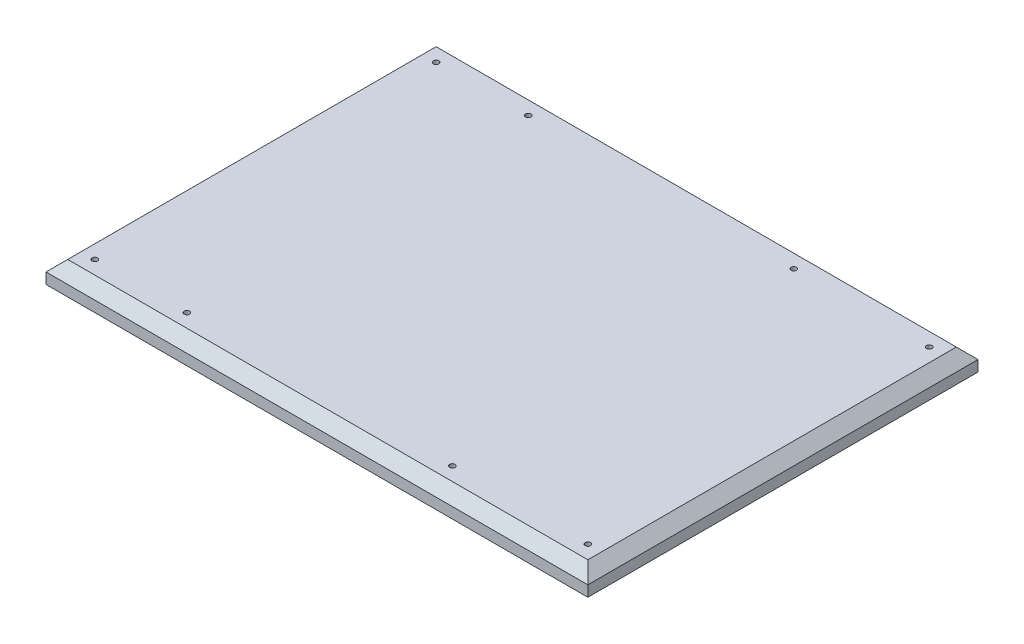
ISO-10303-21;
HEADER;
FILE_DESCRIPTION(('STEP AP214'),'2;1');
FILE_NAME('part.step','',(''),(''),'','','');
FILE_SCHEMA(('AUTOMOTIVE_DESIGN { 1 0 10303 214 1 1 1 1 }'));
ENDSEC;
DATA;
#1=APPLICATION_CONTEXT('core data for automotive mechanical design processes');
#2=APPLICATION_PROTOCOL_DEFINITION('international standard','automotive_design',2000,#1);
#3=PRODUCT_CONTEXT('',#1,'mechanical');
#4=PRODUCT('Part','Part','',(#3));
#5=PRODUCT_RELATED_PRODUCT_CATEGORY('part','',(#4));
#6=PRODUCT_DEFINITION_FORMATION('','',#4);
#7=PRODUCT_DEFINITION_CONTEXT('part definition',#1,'design');
#8=PRODUCT_DEFINITION('design','',#6,#7);
#9=PRODUCT_DEFINITION_SHAPE('','',#8);
#10=(LENGTH_UNIT() NAMED_UNIT(*) SI_UNIT(.MILLI.,.METRE.));
#11=(NAMED_UNIT(*) PLANE_ANGLE_UNIT() SI_UNIT($,.RADIAN.));
#12=(NAMED_UNIT(*) SI_UNIT($,.STERADIAN.) SOLID_ANGLE_UNIT());
#13=UNCERTAINTY_MEASURE_WITH_UNIT(LENGTH_MEASURE(1.E-05),#10,'distance_accuracy_value','');
#14=(GEOMETRIC_REPRESENTATION_CONTEXT(3) GLOBAL_UNCERTAINTY_ASSIGNED_CONTEXT((#13)) GLOBAL_UNIT_ASSIGNED_CONTEXT((#10,
#11,#12)) REPRESENTATION_CONTEXT('',''));
#15=CARTESIAN_POINT('',(0.,0.,0.));
#16=DIRECTION('',(0.,0.,1.));
#17=DIRECTION('',(1.,0.,0.));
#18=AXIS2_PLACEMENT_3D('',#15,#16,#17);
#19=CARTESIAN_POINT('',(250.,20.,-180.));
#20=DIRECTION('',(-1.,0.,0.));
#21=DIRECTION('',(0.,0.,1.));
#22=AXIS2_PLACEMENT_3D('',#19,#20,#21);
#23=PLANE('',#22);
#24=DIRECTION('',(0.,-1.,0.));
#25=VECTOR('',#24,1.);
#26=CARTESIAN_POINT('',(250.,20.,-180.));
#27=LINE('',#26,#25);
#28=CARTESIAN_POINT('',(250.,9.99999999999999,-180.));
#29=VERTEX_POINT('',#28);
#30=CARTESIAN_POINT('',(250.,0.,-180.));
#31=VERTEX_POINT('',#30);
#32=EDGE_CURVE('E84',#29,#31,#27,.T.);
#33=ORIENTED_EDGE('',*,*,#32,.F.);
#34=DIRECTION('',(0.,0.,1.));
#35=VECTOR('',#34,1.);
#36=CARTESIAN_POINT('',(250.,9.99999999999999,180.));
#37=LINE('',#36,#35);
#38=CARTESIAN_POINT('',(250.,9.99999999999999,180.));
#39=VERTEX_POINT('',#38);
#40=EDGE_CURVE('E11',#29,#39,#37,.T.);
#41=ORIENTED_EDGE('',*,*,#40,.T.);
#42=DIRECTION('',(0.,-1.,0.));
#43=VECTOR('',#42,1.);
#44=CARTESIAN_POINT('',(250.,20.,180.));
#45=LINE('',#44,#43);
#46=CARTESIAN_POINT('',(250.,0.,180.));
#47=VERTEX_POINT('',#46);
#48=EDGE_CURVE('E104',#39,#47,#45,.T.);
#49=ORIENTED_EDGE('',*,*,#48,.T.);
#50=DIRECTION('',(0.,0.,-1.));
#51=VECTOR('',#50,1.);
#52=CARTESIAN_POINT('',(250.,0.,-180.));
#53=LINE('',#52,#51);
#54=EDGE_CURVE('E99',#47,#31,#53,.T.);
#55=ORIENTED_EDGE('',*,*,#54,.T.);
#56=EDGE_LOOP('',(#33,#41,#49,#55));
#57=FACE_BOUND('',#56,.T.);
#58=ADVANCED_FACE('F32',(#57),#23,.F.);
#59=CARTESIAN_POINT('',(-250.,20.,-180.));
#60=DIRECTION('',(0.,0.,1.));
#61=DIRECTION('',(1.,0.,0.));
#62=AXIS2_PLACEMENT_3D('',#59,#60,#61);
#63=PLANE('',#62);
#64=DIRECTION('',(0.,-1.,0.));
#65=VECTOR('',#64,1.);
#66=CARTESIAN_POINT('',(-250.,20.,-180.));
#67=LINE('',#66,#65);
#68=CARTESIAN_POINT('',(-250.,9.99999999999999,-180.));
#69=VERTEX_POINT('',#68);
#70=CARTESIAN_POINT('',(-250.,0.,-180.));
#71=VERTEX_POINT('',#70);
#72=EDGE_CURVE('E93',#69,#71,#67,.T.);
#73=ORIENTED_EDGE('',*,*,#72,.F.);
#74=DIRECTION('',(1.,0.,0.));
#75=VECTOR('',#74,1.);
#76=CARTESIAN_POINT('',(250.,9.99999999999999,-180.));
#77=LINE('',#76,#75);
#78=EDGE_CURVE('E41',#69,#29,#77,.T.);
#79=ORIENTED_EDGE('',*,*,#78,.T.);
#80=ORIENTED_EDGE('',*,*,#32,.T.);
#81=DIRECTION('',(-1.,0.,0.));
#82=VECTOR('',#81,1.);
#83=CARTESIAN_POINT('',(-250.,0.,-180.));
#84=LINE('',#83,#82);
#85=EDGE_CURVE('E87',#31,#71,#84,.T.);
#86=ORIENTED_EDGE('',*,*,#85,.T.);
#87=EDGE_LOOP('',(#73,#79,#80,#86));
#88=FACE_BOUND('',#87,.T.);
#89=ADVANCED_FACE('F86',(#88),#63,.F.);
#90=CARTESIAN_POINT('',(-250.,20.,-180.));
#91=DIRECTION('',(1.,0.,0.));
#92=DIRECTION('',(0.,0.,-1.));
#93=AXIS2_PLACEMENT_3D('',#90,#91,#92);
#94=PLANE('',#93);
#95=DIRECTION('',(0.,-1.,0.));
#96=VECTOR('',#95,1.);
#97=CARTESIAN_POINT('',(-250.,20.,180.));
#98=LINE('',#97,#96);
#99=CARTESIAN_POINT('',(-250.,9.99999999999999,180.));
#100=VERTEX_POINT('',#99);
#101=CARTESIAN_POINT('',(-250.,0.,180.));
#102=VERTEX_POINT('',#101);
#103=EDGE_CURVE('E117',#100,#102,#98,.T.);
#104=ORIENTED_EDGE('',*,*,#103,.F.);
#105=DIRECTION('',(0.,0.,-1.));
#106=VECTOR('',#105,1.);
#107=CARTESIAN_POINT('',(-250.,9.99999999999999,-180.));
#108=LINE('',#107,#106);
#109=EDGE_CURVE('E56',#100,#69,#108,.T.);
#110=ORIENTED_EDGE('',*,*,#109,.T.);
#111=ORIENTED_EDGE('',*,*,#72,.T.);
#112=DIRECTION('',(0.,0.,1.));
#113=VECTOR('',#112,1.);
#114=CARTESIAN_POINT('',(-250.,0.,-180.));
#115=LINE('',#114,#113);
#116=EDGE_CURVE('E101',#71,#102,#115,.T.);
#117=ORIENTED_EDGE('',*,*,#116,.T.);
#118=EDGE_LOOP('',(#104,#110,#111,#117));
#119=FACE_BOUND('',#118,.T.);
#120=ADVANCED_FACE('F156',(#119),#94,.F.);
#121=CARTESIAN_POINT('',(-250.,20.,180.));
#122=DIRECTION('',(0.,0.,-1.));
#123=DIRECTION('',(-1.,0.,0.));
#124=AXIS2_PLACEMENT_3D('',#121,#122,#123);
#125=PLANE('',#124);
#126=ORIENTED_EDGE('',*,*,#48,.F.);
#127=DIRECTION('',(-1.,0.,0.));
#128=VECTOR('',#127,1.);
#129=CARTESIAN_POINT('',(-250.,9.99999999999999,180.));
#130=LINE('',#129,#128);
#131=EDGE_CURVE('E128',#39,#100,#130,.T.);
#132=ORIENTED_EDGE('',*,*,#131,.T.);
#133=ORIENTED_EDGE('',*,*,#103,.T.);
#134=DIRECTION('',(1.,0.,0.));
#135=VECTOR('',#134,1.);
#136=CARTESIAN_POINT('',(-250.,0.,180.));
#137=LINE('',#136,#135);
#138=EDGE_CURVE('E114',#102,#47,#137,.T.);
#139=ORIENTED_EDGE('',*,*,#138,.T.);
#140=EDGE_LOOP('',(#126,#132,#133,#139));
#141=FACE_BOUND('',#140,.T.);
#142=ADVANCED_FACE('F155',(#141),#125,.F.);
#143=CARTESIAN_POINT('',(0.,20.,0.));
#144=DIRECTION('',(0.,1.,0.));
#145=DIRECTION('',(0.,0.,1.));
#146=AXIS2_PLACEMENT_3D('',#143,#144,#145);
#147=PLANE('',#146);
#148=CARTESIAN_POINT('',(-142.5,20.,157.5));
#149=DIRECTION('',(0.,1.,0.));
#150=DIRECTION('',(0.,0.,1.));
#151=AXIS2_PLACEMENT_3D('',#148,#149,#150);
#152=CIRCLE('',#151,2.50000000000002);
#153=CARTESIAN_POINT('',(-142.5,20.,160.));
#154=VERTEX_POINT('',#153);
#155=EDGE_CURVE('E230',#154,#154,#152,.T.);
#156=ORIENTED_EDGE('',*,*,#155,.F.);
#157=EDGE_LOOP('',(#156));
#158=FACE_BOUND('',#157,.T.);
#159=CARTESIAN_POINT('',(102.5,20.,157.5));
#160=DIRECTION('',(0.,1.,0.));
#161=DIRECTION('',(0.,0.,1.));
#162=AXIS2_PLACEMENT_3D('',#159,#160,#161);
#163=CIRCLE('',#162,2.5);
#164=CARTESIAN_POINT('',(102.5,20.,160.));
#165=VERTEX_POINT('',#164);
#166=EDGE_CURVE('E235',#165,#165,#163,.T.);
#167=ORIENTED_EDGE('',*,*,#166,.F.);
#168=EDGE_LOOP('',(#167));
#169=FACE_BOUND('',#168,.T.);
#170=CARTESIAN_POINT('',(227.5,20.,157.5));
#171=DIRECTION('',(0.,1.,0.));
#172=DIRECTION('',(0.,0.,1.));
#173=AXIS2_PLACEMENT_3D('',#170,#171,#172);
#174=CIRCLE('',#173,2.5);
#175=CARTESIAN_POINT('',(227.5,20.,160.));
#176=VERTEX_POINT('',#175);
#177=EDGE_CURVE('E243',#176,#176,#174,.T.);
#178=ORIENTED_EDGE('',*,*,#177,.F.);
#179=EDGE_LOOP('',(#178));
#180=FACE_BOUND('',#179,.T.);
#181=CARTESIAN_POINT('',(-227.5,20.,-157.5));
#182=DIRECTION('',(0.,1.,0.));
#183=DIRECTION('',(0.,0.,1.));
#184=AXIS2_PLACEMENT_3D('',#181,#182,#183);
#185=CIRCLE('',#184,2.5);
#186=CARTESIAN_POINT('',(-227.5,20.,-155.));
#187=VERTEX_POINT('',#186);
#188=EDGE_CURVE('E249',#187,#187,#185,.T.);
#189=ORIENTED_EDGE('',*,*,#188,.F.);
#190=EDGE_LOOP('',(#189));
#191=FACE_BOUND('',#190,.T.);
#192=CARTESIAN_POINT('',(-142.5,20.,-157.5));
#193=DIRECTION('',(0.,1.,0.));
#194=DIRECTION('',(0.,0.,1.));
#195=AXIS2_PLACEMENT_3D('',#192,#193,#194);
#196=CIRCLE('',#195,2.50000000000002);
#197=CARTESIAN_POINT('',(-142.5,20.,-155.));
#198=VERTEX_POINT('',#197);
#199=EDGE_CURVE('E255',#198,#198,#196,.T.);
#200=ORIENTED_EDGE('',*,*,#199,.F.);
#201=EDGE_LOOP('',(#200));
#202=FACE_BOUND('',#201,.T.);
#203=CARTESIAN_POINT('',(102.5,20.,-157.5));
#204=DIRECTION('',(0.,1.,0.));
#205=DIRECTION('',(0.,0.,1.));
#206=AXIS2_PLACEMENT_3D('',#203,#204,#205);
#207=CIRCLE('',#206,2.5);
#208=CARTESIAN_POINT('',(102.5,20.,-155.));
#209=VERTEX_POINT('',#208);
#210=EDGE_CURVE('E261',#209,#209,#207,.T.);
#211=ORIENTED_EDGE('',*,*,#210,.F.);
#212=EDGE_LOOP('',(#211));
#213=FACE_BOUND('',#212,.T.);
#214=CARTESIAN_POINT('',(227.5,20.,-157.5));
#215=DIRECTION('',(0.,1.,0.));
#216=DIRECTION('',(0.,0.,1.));
#217=AXIS2_PLACEMENT_3D('',#214,#215,#216);
#218=CIRCLE('',#217,2.5);
#219=CARTESIAN_POINT('',(227.5,20.,-155.));
#220=VERTEX_POINT('',#219);
#221=EDGE_CURVE('E267',#220,#220,#218,.T.);
#222=ORIENTED_EDGE('',*,*,#221,.F.);
#223=EDGE_LOOP('',(#222));
#224=FACE_BOUND('',#223,.T.);
#225=CARTESIAN_POINT('',(-227.5,20.,157.5));
#226=DIRECTION('',(0.,1.,0.));
#227=DIRECTION('',(0.,0.,1.));
#228=AXIS2_PLACEMENT_3D('',#225,#226,#227);
#229=CIRCLE('',#228,2.5);
#230=CARTESIAN_POINT('',(-227.5,20.,160.));
#231=VERTEX_POINT('',#230);
#232=EDGE_CURVE('E110',#231,#231,#229,.T.);
#233=ORIENTED_EDGE('',*,*,#232,.F.);
#234=EDGE_LOOP('',(#233));
#235=FACE_BOUND('',#234,.T.);
#236=DIRECTION('',(0.,0.,1.));
#237=VECTOR('',#236,1.);
#238=CARTESIAN_POINT('',(-240.,20.,180.));
#239=LINE('',#238,#237);
#240=CARTESIAN_POINT('',(-240.,20.,-170.));
#241=VERTEX_POINT('',#240);
#242=CARTESIAN_POINT('',(-240.,20.,170.));
#243=VERTEX_POINT('',#242);
#244=EDGE_CURVE('E123',#241,#243,#239,.T.);
#245=ORIENTED_EDGE('',*,*,#244,.T.);
#246=DIRECTION('',(1.,0.,0.));
#247=VECTOR('',#246,1.);
#248=CARTESIAN_POINT('',(250.,20.,170.));
#249=LINE('',#248,#247);
#250=CARTESIAN_POINT('',(240.,20.,170.));
#251=VERTEX_POINT('',#250);
#252=EDGE_CURVE('E125',#243,#251,#249,.T.);
#253=ORIENTED_EDGE('',*,*,#252,.T.);
#254=DIRECTION('',(0.,0.,-1.));
#255=VECTOR('',#254,1.);
#256=CARTESIAN_POINT('',(240.,20.,-180.));
#257=LINE('',#256,#255);
#258=CARTESIAN_POINT('',(240.,20.,-170.));
#259=VERTEX_POINT('',#258);
#260=EDGE_CURVE('E92',#251,#259,#257,.T.);
#261=ORIENTED_EDGE('',*,*,#260,.T.);
#262=DIRECTION('',(-1.,0.,0.));
#263=VECTOR('',#262,1.);
#264=CARTESIAN_POINT('',(-250.,20.,-170.));
#265=LINE('',#264,#263);
#266=EDGE_CURVE('E121',#259,#241,#265,.T.);
#267=ORIENTED_EDGE('',*,*,#266,.T.);
#268=EDGE_LOOP('',(#245,#253,#261,#267));
#269=FACE_BOUND('',#268,.T.);
#270=ADVANCED_FACE('F148',(#158,#169,#180,#191,#202,#213,#224,#235,#269),#147,.T.);
#271=CARTESIAN_POINT('',(0.,0.,0.));
#272=DIRECTION('',(0.,1.,0.));
#273=DIRECTION('',(0.,0.,1.));
#274=AXIS2_PLACEMENT_3D('',#271,#272,#273);
#275=PLANE('',#274);
#276=CARTESIAN_POINT('',(-142.5,0.,157.5));
#277=DIRECTION('',(0.,1.,0.));
#278=DIRECTION('',(0.,0.,1.));
#279=AXIS2_PLACEMENT_3D('',#276,#277,#278);
#280=CIRCLE('',#279,2.50000000000002);
#281=CARTESIAN_POINT('',(-142.5,0.,160.));
#282=VERTEX_POINT('',#281);
#283=EDGE_CURVE('E227',#282,#282,#280,.T.);
#284=ORIENTED_EDGE('',*,*,#283,.T.);
#285=EDGE_LOOP('',(#284));
#286=FACE_BOUND('',#285,.T.);
#287=CARTESIAN_POINT('',(102.5,0.,157.5));
#288=DIRECTION('',(0.,1.,0.));
#289=DIRECTION('',(0.,0.,1.));
#290=AXIS2_PLACEMENT_3D('',#287,#288,#289);
#291=CIRCLE('',#290,2.5);
#292=CARTESIAN_POINT('',(102.5,0.,160.));
#293=VERTEX_POINT('',#292);
#294=EDGE_CURVE('E231',#293,#293,#291,.T.);
#295=ORIENTED_EDGE('',*,*,#294,.T.);
#296=EDGE_LOOP('',(#295));
#297=FACE_BOUND('',#296,.T.);
#298=CARTESIAN_POINT('',(227.5,0.,157.5));
#299=DIRECTION('',(0.,1.,0.));
#300=DIRECTION('',(0.,0.,1.));
#301=AXIS2_PLACEMENT_3D('',#298,#299,#300);
#302=CIRCLE('',#301,2.5);
#303=CARTESIAN_POINT('',(227.5,0.,160.));
#304=VERTEX_POINT('',#303);
#305=EDGE_CURVE('E240',#304,#304,#302,.T.);
#306=ORIENTED_EDGE('',*,*,#305,.T.);
#307=EDGE_LOOP('',(#306));
#308=FACE_BOUND('',#307,.T.);
#309=CARTESIAN_POINT('',(-227.5,0.,-157.5));
#310=DIRECTION('',(0.,1.,0.));
#311=DIRECTION('',(0.,0.,1.));
#312=AXIS2_PLACEMENT_3D('',#309,#310,#311);
#313=CIRCLE('',#312,2.5);
#314=CARTESIAN_POINT('',(-227.5,0.,-155.));
#315=VERTEX_POINT('',#314);
#316=EDGE_CURVE('E246',#315,#315,#313,.T.);
#317=ORIENTED_EDGE('',*,*,#316,.T.);
#318=EDGE_LOOP('',(#317));
#319=FACE_BOUND('',#318,.T.);
#320=CARTESIAN_POINT('',(-142.5,0.,-157.5));
#321=DIRECTION('',(0.,1.,0.));
#322=DIRECTION('',(0.,0.,1.));
#323=AXIS2_PLACEMENT_3D('',#320,#321,#322);
#324=CIRCLE('',#323,2.50000000000002);
#325=CARTESIAN_POINT('',(-142.5,0.,-155.));
#326=VERTEX_POINT('',#325);
#327=EDGE_CURVE('E252',#326,#326,#324,.T.);
#328=ORIENTED_EDGE('',*,*,#327,.T.);
#329=EDGE_LOOP('',(#328));
#330=FACE_BOUND('',#329,.T.);
#331=CARTESIAN_POINT('',(102.5,0.,-157.5));
#332=DIRECTION('',(0.,1.,0.));
#333=DIRECTION('',(0.,0.,1.));
#334=AXIS2_PLACEMENT_3D('',#331,#332,#333);
#335=CIRCLE('',#334,2.5);
#336=CARTESIAN_POINT('',(102.5,0.,-155.));
#337=VERTEX_POINT('',#336);
#338=EDGE_CURVE('E258',#337,#337,#335,.T.);
#339=ORIENTED_EDGE('',*,*,#338,.T.);
#340=EDGE_LOOP('',(#339));
#341=FACE_BOUND('',#340,.T.);
#342=CARTESIAN_POINT('',(227.5,0.,-157.5));
#343=DIRECTION('',(0.,1.,0.));
#344=DIRECTION('',(0.,0.,1.));
#345=AXIS2_PLACEMENT_3D('',#342,#343,#344);
#346=CIRCLE('',#345,2.5);
#347=CARTESIAN_POINT('',(227.5,0.,-155.));
#348=VERTEX_POINT('',#347);
#349=EDGE_CURVE('E264',#348,#348,#346,.T.);
#350=ORIENTED_EDGE('',*,*,#349,.T.);
#351=EDGE_LOOP('',(#350));
#352=FACE_BOUND('',#351,.T.);
#353=CARTESIAN_POINT('',(-227.5,0.,157.5));
#354=DIRECTION('',(0.,1.,0.));
#355=DIRECTION('',(0.,0.,1.));
#356=AXIS2_PLACEMENT_3D('',#353,#354,#355);
#357=CIRCLE('',#356,2.5);
#358=CARTESIAN_POINT('',(-227.5,0.,160.));
#359=VERTEX_POINT('',#358);
#360=EDGE_CURVE('E136',#359,#359,#357,.T.);
#361=ORIENTED_EDGE('',*,*,#360,.T.);
#362=EDGE_LOOP('',(#361));
#363=FACE_BOUND('',#362,.T.);
#364=ORIENTED_EDGE('',*,*,#54,.F.);
#365=ORIENTED_EDGE('',*,*,#138,.F.);
#366=ORIENTED_EDGE('',*,*,#116,.F.);
#367=ORIENTED_EDGE('',*,*,#85,.F.);
#368=EDGE_LOOP('',(#364,#365,#366,#367));
#369=FACE_BOUND('',#368,.T.);
#370=ADVANCED_FACE('F97',(#286,#297,#308,#319,#330,#341,#352,#363,#369),#275,.F.);
#371=CARTESIAN_POINT('',(0.,20.,-170.));
#372=DIRECTION('',(0.,0.707106781186549,-0.707106781186545));
#373=DIRECTION('',(1.,0.,0.));
#374=AXIS2_PLACEMENT_3D('',#371,#372,#373);
#375=PLANE('',#374);
#376=DIRECTION('',(-0.577350269189628,0.577350269189623,0.577350269189626));
#377=VECTOR('',#376,1.);
#378=CARTESIAN_POINT('',(183.333333333333,76.6666666666664,-113.333333333333));
#379=LINE('',#378,#377);
#380=EDGE_CURVE('E108',#29,#259,#379,.T.);
#381=ORIENTED_EDGE('',*,*,#380,.F.);
#382=ORIENTED_EDGE('',*,*,#78,.F.);
#383=DIRECTION('',(0.577350269189625,0.577350269189624,0.577350269189628));
#384=VECTOR('',#383,1.);
#385=CARTESIAN_POINT('',(-160.,99.9999999999997,-89.9999999999998));
#386=LINE('',#385,#384);
#387=EDGE_CURVE('E36',#241,#69,#386,.F.);
#388=ORIENTED_EDGE('',*,*,#387,.F.);
#389=ORIENTED_EDGE('',*,*,#266,.F.);
#390=EDGE_LOOP('',(#381,#382,#388,#389));
#391=FACE_BOUND('',#390,.T.);
#392=ADVANCED_FACE('F34',(#391),#375,.T.);
#393=CARTESIAN_POINT('',(-240.,20.,0.));
#394=DIRECTION('',(-0.707106781186547,0.707106781186548,0.));
#395=DIRECTION('',(0.,0.,-1.));
#396=AXIS2_PLACEMENT_3D('',#393,#394,#395);
#397=PLANE('',#396);
#398=ORIENTED_EDGE('',*,*,#387,.T.);
#399=ORIENTED_EDGE('',*,*,#109,.F.);
#400=DIRECTION('',(0.577350269189625,0.577350269189624,-0.577350269189628));
#401=VECTOR('',#400,1.);
#402=CARTESIAN_POINT('',(-183.333333333333,76.6666666666667,113.333333333333));
#403=LINE('',#402,#401);
#404=EDGE_CURVE('E135',#243,#100,#403,.F.);
#405=ORIENTED_EDGE('',*,*,#404,.F.);
#406=ORIENTED_EDGE('',*,*,#244,.F.);
#407=EDGE_LOOP('',(#398,#399,#405,#406));
#408=FACE_BOUND('',#407,.T.);
#409=ADVANCED_FACE('F174',(#408),#397,.T.);
#410=CARTESIAN_POINT('',(240.,20.,0.));
#411=DIRECTION('',(0.707106781186544,0.707106781186551,0.));
#412=DIRECTION('',(0.,0.,1.));
#413=AXIS2_PLACEMENT_3D('',#410,#411,#412);
#414=PLANE('',#413);
#415=ORIENTED_EDGE('',*,*,#380,.T.);
#416=ORIENTED_EDGE('',*,*,#260,.F.);
#417=DIRECTION('',(0.577350269189629,-0.577350269189623,0.577350269189626));
#418=VECTOR('',#417,1.);
#419=CARTESIAN_POINT('',(183.333333333333,76.6666666666664,113.333333333333));
#420=LINE('',#419,#418);
#421=EDGE_CURVE('E133',#39,#251,#420,.F.);
#422=ORIENTED_EDGE('',*,*,#421,.F.);
#423=ORIENTED_EDGE('',*,*,#40,.F.);
#424=EDGE_LOOP('',(#415,#416,#422,#423));
#425=FACE_BOUND('',#424,.T.);
#426=ADVANCED_FACE('F141',(#425),#414,.T.);
#427=CARTESIAN_POINT('',(0.,20.,170.));
#428=DIRECTION('',(0.,0.707106781186549,0.707106781186545));
#429=DIRECTION('',(-1.,0.,0.));
#430=AXIS2_PLACEMENT_3D('',#427,#428,#429);
#431=PLANE('',#430);
#432=ORIENTED_EDGE('',*,*,#404,.T.);
#433=ORIENTED_EDGE('',*,*,#131,.F.);
#434=ORIENTED_EDGE('',*,*,#421,.T.);
#435=ORIENTED_EDGE('',*,*,#252,.F.);
#436=EDGE_LOOP('',(#432,#433,#434,#435));
#437=FACE_BOUND('',#436,.T.);
#438=ADVANCED_FACE('F152',(#437),#431,.T.);
#439=CARTESIAN_POINT('',(-227.5,0.,157.5));
#440=DIRECTION('',(0.,1.,0.));
#441=DIRECTION('',(0.,0.,1.));
#442=AXIS2_PLACEMENT_3D('',#439,#440,#441);
#443=CYLINDRICAL_SURFACE('',#442,2.5);
#444=ORIENTED_EDGE('',*,*,#360,.F.);
#445=EDGE_LOOP('',(#444));
#446=FACE_BOUND('',#445,.T.);
#447=ORIENTED_EDGE('',*,*,#232,.T.);
#448=EDGE_LOOP('',(#447));
#449=FACE_BOUND('',#448,.T.);
#450=ADVANCED_FACE('F172',(#446,#449),#443,.F.);
#451=CARTESIAN_POINT('',(227.5,0.,-157.5));
#452=DIRECTION('',(0.,1.,0.));
#453=DIRECTION('',(0.,0.,1.));
#454=AXIS2_PLACEMENT_3D('',#451,#452,#453);
#455=CYLINDRICAL_SURFACE('',#454,2.5);
#456=ORIENTED_EDGE('',*,*,#349,.F.);
#457=EDGE_LOOP('',(#456));
#458=FACE_BOUND('',#457,.T.);
#459=ORIENTED_EDGE('',*,*,#221,.T.);
#460=EDGE_LOOP('',(#459));
#461=FACE_BOUND('',#460,.T.);
#462=ADVANCED_FACE('F195',(#458,#461),#455,.F.);
#463=CARTESIAN_POINT('',(102.5,0.,-157.5));
#464=DIRECTION('',(0.,1.,0.));
#465=DIRECTION('',(0.,0.,1.));
#466=AXIS2_PLACEMENT_3D('',#463,#464,#465);
#467=CYLINDRICAL_SURFACE('',#466,2.5);
#468=ORIENTED_EDGE('',*,*,#338,.F.);
#469=EDGE_LOOP('',(#468));
#470=FACE_BOUND('',#469,.T.);
#471=ORIENTED_EDGE('',*,*,#210,.T.);
#472=EDGE_LOOP('',(#471));
#473=FACE_BOUND('',#472,.T.);
#474=ADVANCED_FACE('F199',(#470,#473),#467,.F.);
#475=CARTESIAN_POINT('',(-142.5,0.,-157.5));
#476=DIRECTION('',(0.,1.,0.));
#477=DIRECTION('',(0.,0.,1.));
#478=AXIS2_PLACEMENT_3D('',#475,#476,#477);
#479=CYLINDRICAL_SURFACE('',#478,2.50000000000002);
#480=ORIENTED_EDGE('',*,*,#327,.F.);
#481=EDGE_LOOP('',(#480));
#482=FACE_BOUND('',#481,.T.);
#483=ORIENTED_EDGE('',*,*,#199,.T.);
#484=EDGE_LOOP('',(#483));
#485=FACE_BOUND('',#484,.T.);
#486=ADVANCED_FACE('F203',(#482,#485),#479,.F.);
#487=CARTESIAN_POINT('',(-227.5,0.,-157.5));
#488=DIRECTION('',(0.,1.,0.));
#489=DIRECTION('',(0.,0.,1.));
#490=AXIS2_PLACEMENT_3D('',#487,#488,#489);
#491=CYLINDRICAL_SURFACE('',#490,2.5);
#492=ORIENTED_EDGE('',*,*,#316,.F.);
#493=EDGE_LOOP('',(#492));
#494=FACE_BOUND('',#493,.T.);
#495=ORIENTED_EDGE('',*,*,#188,.T.);
#496=EDGE_LOOP('',(#495));
#497=FACE_BOUND('',#496,.T.);
#498=ADVANCED_FACE('F207',(#494,#497),#491,.F.);
#499=CARTESIAN_POINT('',(227.5,0.,157.5));
#500=DIRECTION('',(0.,1.,0.));
#501=DIRECTION('',(0.,0.,1.));
#502=AXIS2_PLACEMENT_3D('',#499,#500,#501);
#503=CYLINDRICAL_SURFACE('',#502,2.5);
#504=ORIENTED_EDGE('',*,*,#305,.F.);
#505=EDGE_LOOP('',(#504));
#506=FACE_BOUND('',#505,.T.);
#507=ORIENTED_EDGE('',*,*,#177,.T.);
#508=EDGE_LOOP('',(#507));
#509=FACE_BOUND('',#508,.T.);
#510=ADVANCED_FACE('F211',(#506,#509),#503,.F.);
#511=CARTESIAN_POINT('',(102.5,0.,157.5));
#512=DIRECTION('',(0.,1.,0.));
#513=DIRECTION('',(0.,0.,1.));
#514=AXIS2_PLACEMENT_3D('',#511,#512,#513);
#515=CYLINDRICAL_SURFACE('',#514,2.5);
#516=ORIENTED_EDGE('',*,*,#294,.F.);
#517=EDGE_LOOP('',(#516));
#518=FACE_BOUND('',#517,.T.);
#519=ORIENTED_EDGE('',*,*,#166,.T.);
#520=EDGE_LOOP('',(#519));
#521=FACE_BOUND('',#520,.T.);
#522=ADVANCED_FACE('F215',(#518,#521),#515,.F.);
#523=CARTESIAN_POINT('',(-142.5,0.,157.5));
#524=DIRECTION('',(0.,1.,0.));
#525=DIRECTION('',(0.,0.,1.));
#526=AXIS2_PLACEMENT_3D('',#523,#524,#525);
#527=CYLINDRICAL_SURFACE('',#526,2.50000000000002);
#528=ORIENTED_EDGE('',*,*,#283,.F.);
#529=EDGE_LOOP('',(#528));
#530=FACE_BOUND('',#529,.T.);
#531=ORIENTED_EDGE('',*,*,#155,.T.);
#532=EDGE_LOOP('',(#531));
#533=FACE_BOUND('',#532,.T.);
#534=ADVANCED_FACE('F219',(#530,#533),#527,.F.);
#535=CLOSED_SHELL('',(#58,#89,#120,#142,#270,#370,#392,#409,#426,#438,#450,#462,#474,#486,#498,
#510,#522,#534));
#536=MANIFOLD_SOLID_BREP('B2',#535);
#537=ADVANCED_BREP_SHAPE_REPRESENTATION('',(#18,#536),#14);
#538=SHAPE_DEFINITION_REPRESENTATION(#9,#537);
ENDSEC;
END-ISO-10303-21;
